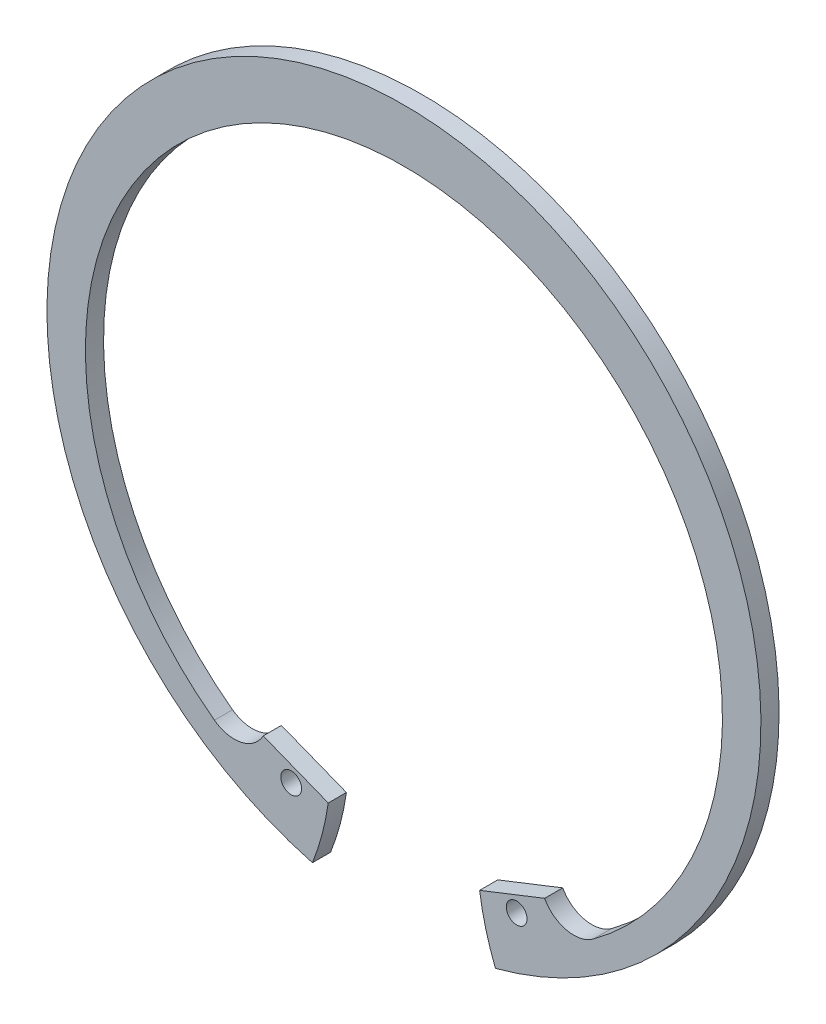
ISO-10303-21;
HEADER;
FILE_DESCRIPTION(('STEP AP214'),'2;1');
FILE_NAME('part.step','',(''),(''),'','','');
FILE_SCHEMA(('AUTOMOTIVE_DESIGN { 1 0 10303 214 1 1 1 1 }'));
ENDSEC;
DATA;
#1=APPLICATION_CONTEXT('core data for automotive mechanical design processes');
#2=APPLICATION_PROTOCOL_DEFINITION('international standard','automotive_design',2000,#1);
#3=PRODUCT_CONTEXT('',#1,'mechanical');
#4=PRODUCT('Part','Part','',(#3));
#5=PRODUCT_RELATED_PRODUCT_CATEGORY('part','',(#4));
#6=PRODUCT_DEFINITION_FORMATION('','',#4);
#7=PRODUCT_DEFINITION_CONTEXT('part definition',#1,'design');
#8=PRODUCT_DEFINITION('design','',#6,#7);
#9=PRODUCT_DEFINITION_SHAPE('','',#8);
#10=(LENGTH_UNIT() NAMED_UNIT(*) SI_UNIT(.MILLI.,.METRE.));
#11=(NAMED_UNIT(*) PLANE_ANGLE_UNIT() SI_UNIT($,.RADIAN.));
#12=(NAMED_UNIT(*) SI_UNIT($,.STERADIAN.) SOLID_ANGLE_UNIT());
#13=UNCERTAINTY_MEASURE_WITH_UNIT(LENGTH_MEASURE(1.E-05),#10,'distance_accuracy_value','');
#14=(GEOMETRIC_REPRESENTATION_CONTEXT(3) GLOBAL_UNCERTAINTY_ASSIGNED_CONTEXT((#13)) GLOBAL_UNIT_ASSIGNED_CONTEXT((#10,
#11,#12)) REPRESENTATION_CONTEXT('',''));
#15=CARTESIAN_POINT('',(0.,0.,0.));
#16=DIRECTION('',(0.,0.,1.));
#17=DIRECTION('',(1.,0.,0.));
#18=AXIS2_PLACEMENT_3D('',#15,#16,#17);
#19=CARTESIAN_POINT('',(0.,0.,-1.3843));
#20=DIRECTION('',(0.,0.,1.));
#21=DIRECTION('',(1.,0.,0.));
#22=AXIS2_PLACEMENT_3D('',#19,#20,#21);
#23=CYLINDRICAL_SURFACE('',#22,54.4957);
#24=CARTESIAN_POINT('',(0.,0.,1.3843));
#25=DIRECTION('',(0.,0.,1.));
#26=DIRECTION('',(-1.,0.,0.));
#27=AXIS2_PLACEMENT_3D('',#24,#25,#26);
#28=CIRCLE('',#27,54.4957);
#29=CARTESIAN_POINT('',(13.9687113237904,-52.6750075694594,1.3843));
#30=VERTEX_POINT('',#29);
#31=CARTESIAN_POINT('',(-13.9687113237904,-52.6750075694594,1.3843));
#32=VERTEX_POINT('',#31);
#33=EDGE_CURVE('E159',#30,#32,#28,.T.);
#34=ORIENTED_EDGE('',*,*,#33,.F.);
#35=DIRECTION('',(0.,0.,1.));
#36=VECTOR('',#35,1.);
#37=CARTESIAN_POINT('',(13.9687113237904,-52.6750075694594,-1.3843));
#38=LINE('',#37,#36);
#39=CARTESIAN_POINT('',(13.9687113237904,-52.6750075694594,-1.3843));
#40=VERTEX_POINT('',#39);
#41=EDGE_CURVE('E99',#40,#30,#38,.T.);
#42=ORIENTED_EDGE('',*,*,#41,.F.);
#43=CARTESIAN_POINT('',(0.,0.,-1.3843));
#44=DIRECTION('',(0.,0.,1.));
#45=DIRECTION('',(-1.,0.,0.));
#46=AXIS2_PLACEMENT_3D('',#43,#44,#45);
#47=CIRCLE('',#46,54.4957);
#48=CARTESIAN_POINT('',(-13.9687113237904,-52.6750075694594,-1.3843));
#49=VERTEX_POINT('',#48);
#50=EDGE_CURVE('E123',#40,#49,#47,.T.);
#51=ORIENTED_EDGE('',*,*,#50,.T.);
#52=DIRECTION('',(0.,0.,1.));
#53=VECTOR('',#52,1.);
#54=CARTESIAN_POINT('',(-13.9687113237904,-52.6750075694594,-1.3843));
#55=LINE('',#54,#53);
#56=EDGE_CURVE('E170',#49,#32,#55,.T.);
#57=ORIENTED_EDGE('',*,*,#56,.T.);
#58=EDGE_LOOP('',(#34,#42,#51,#57));
#59=FACE_BOUND('',#58,.T.);
#60=ADVANCED_FACE('F32',(#59),#23,.T.);
#61=CARTESIAN_POINT('',(11.3157,-43.6549822906848,-1.3843));
#62=DIRECTION('',(-0.366257344602323,0.930513598785561,0.));
#63=DIRECTION('',(-0.930513598785561,-0.366257344602323,0.));
#64=AXIS2_PLACEMENT_3D('',#61,#62,#63);
#65=PLANE('',#64);
#66=DIRECTION('',(-0.930513598785561,-0.366257344602323,0.));
#67=VECTOR('',#66,1.);
#68=CARTESIAN_POINT('',(11.3157,-43.6549822906848,-1.3843));
#69=LINE('',#68,#67);
#70=CARTESIAN_POINT('',(21.4760620340965,-39.6557852626529,-1.3843));
#71=VERTEX_POINT('',#70);
#72=CARTESIAN_POINT('',(11.5520504540915,-43.5619529251558,-1.3843));
#73=VERTEX_POINT('',#72);
#74=EDGE_CURVE('E104',#71,#73,#69,.T.);
#75=ORIENTED_EDGE('',*,*,#74,.T.);
#76=DIRECTION('',(0.,0.,1.));
#77=VECTOR('',#76,1.);
#78=CARTESIAN_POINT('',(11.5520504540915,-43.5619529251558,-1.3843));
#79=LINE('',#78,#77);
#80=CARTESIAN_POINT('',(11.5520504540915,-43.5619529251558,1.3843));
#81=VERTEX_POINT('',#80);
#82=EDGE_CURVE('E97',#73,#81,#79,.T.);
#83=ORIENTED_EDGE('',*,*,#82,.T.);
#84=DIRECTION('',(-0.930513598785561,-0.366257344602323,0.));
#85=VECTOR('',#84,1.);
#86=CARTESIAN_POINT('',(11.3157,-43.6549822906848,1.3843));
#87=LINE('',#86,#85);
#88=CARTESIAN_POINT('',(21.4760620340965,-39.6557852626529,1.3843));
#89=VERTEX_POINT('',#88);
#90=EDGE_CURVE('E103',#89,#81,#87,.T.);
#91=ORIENTED_EDGE('',*,*,#90,.F.);
#92=DIRECTION('',(0.,0.,1.));
#93=VECTOR('',#92,1.);
#94=CARTESIAN_POINT('',(21.4760620340965,-39.6557852626529,-1.3843));
#95=LINE('',#94,#93);
#96=EDGE_CURVE('E53',#71,#89,#95,.T.);
#97=ORIENTED_EDGE('',*,*,#96,.F.);
#98=EDGE_LOOP('',(#75,#83,#91,#97));
#99=FACE_BOUND('',#98,.T.);
#100=ADVANCED_FACE('F102',(#99),#65,.T.);
#101=CARTESIAN_POINT('',(0.,0.,-1.3843));
#102=DIRECTION('',(0.,0.,-1.));
#103=DIRECTION('',(-1.,0.,0.));
#104=AXIS2_PLACEMENT_3D('',#101,#102,#103);
#105=PLANE('',#104);
#106=CARTESIAN_POINT('',(17.210160294145,-43.7241421284516,-1.3843));
#107=DIRECTION('',(0.,0.,1.));
#108=DIRECTION('',(-1.,0.,0.));
#109=AXIS2_PLACEMENT_3D('',#106,#107,#108);
#110=CIRCLE('',#109,1.5875);
#111=CARTESIAN_POINT('',(15.622660294145,-43.7241421284516,-1.3843));
#112=VERTEX_POINT('',#111);
#113=EDGE_CURVE('E112',#112,#112,#110,.T.);
#114=ORIENTED_EDGE('',*,*,#113,.T.);
#115=EDGE_LOOP('',(#114));
#116=FACE_BOUND('',#115,.T.);
#117=CARTESIAN_POINT('',(-17.210160294145,-43.7241421284516,-1.3843));
#118=DIRECTION('',(0.,0.,1.));
#119=DIRECTION('',(1.,0.,0.));
#120=AXIS2_PLACEMENT_3D('',#117,#118,#119);
#121=CIRCLE('',#120,1.5875);
#122=CARTESIAN_POINT('',(-15.622660294145,-43.7241421284516,-1.3843));
#123=VERTEX_POINT('',#122);
#124=EDGE_CURVE('E115',#123,#123,#121,.T.);
#125=ORIENTED_EDGE('',*,*,#124,.T.);
#126=EDGE_LOOP('',(#125));
#127=FACE_BOUND('',#126,.T.);
#128=ORIENTED_EDGE('',*,*,#50,.F.);
#129=CARTESIAN_POINT('',(51.274948351142,-37.9049292776051,-1.3843));
#130=DIRECTION('',(0.,0.,1.));
#131=DIRECTION('',(1.,0.,0.));
#132=AXIS2_PLACEMENT_3D('',#129,#130,#131);
#133=CIRCLE('',#132,40.1236904320683);
#134=EDGE_CURVE('E105',#73,#40,#133,.T.);
#135=ORIENTED_EDGE('',*,*,#134,.F.);
#136=ORIENTED_EDGE('',*,*,#74,.F.);
#137=CARTESIAN_POINT('',(25.9199064504206,-37.2491684796856,-1.3843));
#138=DIRECTION('',(0.,0.,-1.));
#139=DIRECTION('',(-1.,0.,0.));
#140=AXIS2_PLACEMENT_3D('',#137,#138,#139);
#141=CIRCLE('',#140,5.05366773111916);
#142=CARTESIAN_POINT('',(28.9264347651248,-41.3112301519693,-1.3843));
#143=VERTEX_POINT('',#142);
#144=EDGE_CURVE('E133',#143,#71,#141,.T.);
#145=ORIENTED_EDGE('',*,*,#144,.F.);
#146=CARTESIAN_POINT('',(0.,-2.22928923008952,-1.3843));
#147=DIRECTION('',(0.,0.,-1.));
#148=DIRECTION('',(-1.,0.,0.));
#149=AXIS2_PLACEMENT_3D('',#146,#147,#148);
#150=CIRCLE('',#149,48.6223892300895);
#151=CARTESIAN_POINT('',(-28.9264347651248,-41.3112301519693,-1.3843));
#152=VERTEX_POINT('',#151);
#153=EDGE_CURVE('E130',#152,#143,#150,.T.);
#154=ORIENTED_EDGE('',*,*,#153,.F.);
#155=CARTESIAN_POINT('',(-25.9199064504206,-37.2491684796856,-1.3843));
#156=DIRECTION('',(0.,0.,-1.));
#157=DIRECTION('',(1.,0.,0.));
#158=AXIS2_PLACEMENT_3D('',#155,#156,#157);
#159=CIRCLE('',#158,5.05366773111916);
#160=CARTESIAN_POINT('',(-21.4760620340965,-39.6557852626529,-1.3843));
#161=VERTEX_POINT('',#160);
#162=EDGE_CURVE('E127',#161,#152,#159,.T.);
#163=ORIENTED_EDGE('',*,*,#162,.F.);
#164=DIRECTION('',(-0.930513598785561,0.366257344602323,0.));
#165=VECTOR('',#164,1.);
#166=CARTESIAN_POINT('',(-11.3157,-43.6549822906848,-1.3843));
#167=LINE('',#166,#165);
#168=CARTESIAN_POINT('',(-11.5520504540915,-43.5619529251558,-1.3843));
#169=VERTEX_POINT('',#168);
#170=EDGE_CURVE('E125',#169,#161,#167,.T.);
#171=ORIENTED_EDGE('',*,*,#170,.F.);
#172=CARTESIAN_POINT('',(-51.274948351142,-37.9049292776051,-1.3843));
#173=DIRECTION('',(0.,0.,-1.));
#174=DIRECTION('',(-1.,0.,0.));
#175=AXIS2_PLACEMENT_3D('',#172,#173,#174);
#176=CIRCLE('',#175,40.1236904320683);
#177=EDGE_CURVE('E173',#169,#49,#176,.T.);
#178=ORIENTED_EDGE('',*,*,#177,.T.);
#179=EDGE_LOOP('',(#128,#135,#136,#145,#154,#163,#171,#178));
#180=FACE_BOUND('',#179,.T.);
#181=ADVANCED_FACE('F182',(#116,#127,#180),#105,.T.);
#182=CARTESIAN_POINT('',(0.,0.,1.3843));
#183=DIRECTION('',(0.,0.,-1.));
#184=DIRECTION('',(-1.,0.,0.));
#185=AXIS2_PLACEMENT_3D('',#182,#183,#184);
#186=PLANE('',#185);
#187=CARTESIAN_POINT('',(-17.210160294145,-43.7241421284516,1.3843));
#188=DIRECTION('',(0.,0.,1.));
#189=DIRECTION('',(1.,0.,0.));
#190=AXIS2_PLACEMENT_3D('',#187,#188,#189);
#191=CIRCLE('',#190,1.5875);
#192=CARTESIAN_POINT('',(-15.622660294145,-43.7241421284516,1.3843));
#193=VERTEX_POINT('',#192);
#194=EDGE_CURVE('E163',#193,#193,#191,.T.);
#195=ORIENTED_EDGE('',*,*,#194,.F.);
#196=EDGE_LOOP('',(#195));
#197=FACE_BOUND('',#196,.T.);
#198=CARTESIAN_POINT('',(17.210160294145,-43.7241421284516,1.3843));
#199=DIRECTION('',(0.,0.,1.));
#200=DIRECTION('',(-1.,0.,0.));
#201=AXIS2_PLACEMENT_3D('',#198,#199,#200);
#202=CIRCLE('',#201,1.5875);
#203=CARTESIAN_POINT('',(15.622660294145,-43.7241421284516,1.3843));
#204=VERTEX_POINT('',#203);
#205=EDGE_CURVE('E166',#204,#204,#202,.T.);
#206=ORIENTED_EDGE('',*,*,#205,.F.);
#207=EDGE_LOOP('',(#206));
#208=FACE_BOUND('',#207,.T.);
#209=CARTESIAN_POINT('',(51.274948351142,-37.9049292776051,1.3843));
#210=DIRECTION('',(0.,0.,-1.));
#211=DIRECTION('',(-1.,0.,0.));
#212=AXIS2_PLACEMENT_3D('',#209,#210,#211);
#213=CIRCLE('',#212,40.1236904320683);
#214=EDGE_CURVE('E11',#30,#81,#213,.T.);
#215=ORIENTED_EDGE('',*,*,#214,.F.);
#216=ORIENTED_EDGE('',*,*,#33,.T.);
#217=CARTESIAN_POINT('',(-51.274948351142,-37.9049292776051,1.3843));
#218=DIRECTION('',(0.,0.,-1.));
#219=DIRECTION('',(-1.,0.,0.));
#220=AXIS2_PLACEMENT_3D('',#217,#218,#219);
#221=CIRCLE('',#220,40.1236904320683);
#222=CARTESIAN_POINT('',(-11.5520504540915,-43.5619529251558,1.3843));
#223=VERTEX_POINT('',#222);
#224=EDGE_CURVE('E39',#32,#223,#221,.F.);
#225=ORIENTED_EDGE('',*,*,#224,.T.);
#226=DIRECTION('',(-0.930513598785561,0.366257344602323,0.));
#227=VECTOR('',#226,1.);
#228=CARTESIAN_POINT('',(-11.3157,-43.6549822906848,1.3843));
#229=LINE('',#228,#227);
#230=CARTESIAN_POINT('',(-21.4760620340965,-39.6557852626529,1.3843));
#231=VERTEX_POINT('',#230);
#232=EDGE_CURVE('E150',#223,#231,#229,.T.);
#233=ORIENTED_EDGE('',*,*,#232,.T.);
#234=CARTESIAN_POINT('',(-25.9199064504206,-37.2491684796856,1.3843));
#235=DIRECTION('',(0.,0.,-1.));
#236=DIRECTION('',(1.,0.,0.));
#237=AXIS2_PLACEMENT_3D('',#234,#235,#236);
#238=CIRCLE('',#237,5.05366773111916);
#239=CARTESIAN_POINT('',(-28.9264347651248,-41.3112301519693,1.3843));
#240=VERTEX_POINT('',#239);
#241=EDGE_CURVE('E155',#231,#240,#238,.T.);
#242=ORIENTED_EDGE('',*,*,#241,.T.);
#243=CARTESIAN_POINT('',(0.,-2.22928923008952,1.3843));
#244=DIRECTION('',(0.,0.,-1.));
#245=DIRECTION('',(-1.,0.,0.));
#246=AXIS2_PLACEMENT_3D('',#243,#244,#245);
#247=CIRCLE('',#246,48.6223892300895);
#248=CARTESIAN_POINT('',(28.9264347651248,-41.3112301519693,1.3843));
#249=VERTEX_POINT('',#248);
#250=EDGE_CURVE('E117',#240,#249,#247,.T.);
#251=ORIENTED_EDGE('',*,*,#250,.T.);
#252=CARTESIAN_POINT('',(25.9199064504206,-37.2491684796856,1.3843));
#253=DIRECTION('',(0.,0.,-1.));
#254=DIRECTION('',(-1.,0.,0.));
#255=AXIS2_PLACEMENT_3D('',#252,#253,#254);
#256=CIRCLE('',#255,5.05366773111916);
#257=EDGE_CURVE('E111',#249,#89,#256,.T.);
#258=ORIENTED_EDGE('',*,*,#257,.T.);
#259=ORIENTED_EDGE('',*,*,#90,.T.);
#260=EDGE_LOOP('',(#215,#216,#225,#233,#242,#251,#258,#259));
#261=FACE_BOUND('',#260,.T.);
#262=ADVANCED_FACE('F108',(#197,#208,#261),#186,.F.);
#263=CARTESIAN_POINT('',(25.9199064504206,-37.2491684796856,-1.3843));
#264=DIRECTION('',(0.,0.,1.));
#265=DIRECTION('',(1.,0.,0.));
#266=AXIS2_PLACEMENT_3D('',#263,#264,#265);
#267=CYLINDRICAL_SURFACE('',#266,5.05366773111916);
#268=ORIENTED_EDGE('',*,*,#96,.T.);
#269=ORIENTED_EDGE('',*,*,#257,.F.);
#270=DIRECTION('',(0.,0.,1.));
#271=VECTOR('',#270,1.);
#272=CARTESIAN_POINT('',(28.9264347651248,-41.3112301519693,-1.3843));
#273=LINE('',#272,#271);
#274=EDGE_CURVE('E139',#143,#249,#273,.T.);
#275=ORIENTED_EDGE('',*,*,#274,.F.);
#276=ORIENTED_EDGE('',*,*,#144,.T.);
#277=EDGE_LOOP('',(#268,#269,#275,#276));
#278=FACE_BOUND('',#277,.T.);
#279=ADVANCED_FACE('F209',(#278),#267,.F.);
#280=CARTESIAN_POINT('',(0.,-2.22928923008952,-1.3843));
#281=DIRECTION('',(0.,0.,1.));
#282=DIRECTION('',(1.,0.,0.));
#283=AXIS2_PLACEMENT_3D('',#280,#281,#282);
#284=CYLINDRICAL_SURFACE('',#283,48.6223892300895);
#285=ORIENTED_EDGE('',*,*,#274,.T.);
#286=ORIENTED_EDGE('',*,*,#250,.F.);
#287=DIRECTION('',(0.,0.,1.));
#288=VECTOR('',#287,1.);
#289=CARTESIAN_POINT('',(-28.9264347651248,-41.3112301519693,-1.3843));
#290=LINE('',#289,#288);
#291=EDGE_CURVE('E141',#152,#240,#290,.T.);
#292=ORIENTED_EDGE('',*,*,#291,.F.);
#293=ORIENTED_EDGE('',*,*,#153,.T.);
#294=EDGE_LOOP('',(#285,#286,#292,#293));
#295=FACE_BOUND('',#294,.T.);
#296=ADVANCED_FACE('F212',(#295),#284,.F.);
#297=CARTESIAN_POINT('',(-25.9199064504206,-37.2491684796856,-1.3843));
#298=DIRECTION('',(0.,0.,1.));
#299=DIRECTION('',(1.,0.,0.));
#300=AXIS2_PLACEMENT_3D('',#297,#298,#299);
#301=CYLINDRICAL_SURFACE('',#300,5.05366773111916);
#302=ORIENTED_EDGE('',*,*,#291,.T.);
#303=ORIENTED_EDGE('',*,*,#241,.F.);
#304=DIRECTION('',(0.,0.,1.));
#305=VECTOR('',#304,1.);
#306=CARTESIAN_POINT('',(-21.4760620340965,-39.6557852626529,-1.3843));
#307=LINE('',#306,#305);
#308=EDGE_CURVE('E137',#161,#231,#307,.T.);
#309=ORIENTED_EDGE('',*,*,#308,.F.);
#310=ORIENTED_EDGE('',*,*,#162,.T.);
#311=EDGE_LOOP('',(#302,#303,#309,#310));
#312=FACE_BOUND('',#311,.T.);
#313=ADVANCED_FACE('F156',(#312),#301,.F.);
#314=CARTESIAN_POINT('',(-11.3157,-43.6549822906848,-1.3843));
#315=DIRECTION('',(0.366257344602323,0.930513598785561,0.));
#316=DIRECTION('',(-0.930513598785561,0.366257344602323,0.));
#317=AXIS2_PLACEMENT_3D('',#314,#315,#316);
#318=PLANE('',#317);
#319=DIRECTION('',(0.,0.,1.));
#320=VECTOR('',#319,1.);
#321=CARTESIAN_POINT('',(-11.5520504540915,-43.5619529251558,-1.3843));
#322=LINE('',#321,#320);
#323=EDGE_CURVE('E169',#169,#223,#322,.T.);
#324=ORIENTED_EDGE('',*,*,#323,.F.);
#325=ORIENTED_EDGE('',*,*,#170,.T.);
#326=ORIENTED_EDGE('',*,*,#308,.T.);
#327=ORIENTED_EDGE('',*,*,#232,.F.);
#328=EDGE_LOOP('',(#324,#325,#326,#327));
#329=FACE_BOUND('',#328,.T.);
#330=ADVANCED_FACE('F149',(#329),#318,.T.);
#331=CARTESIAN_POINT('',(-17.210160294145,-43.7241421284516,-1.3843));
#332=DIRECTION('',(0.,0.,1.));
#333=DIRECTION('',(1.,0.,0.));
#334=AXIS2_PLACEMENT_3D('',#331,#332,#333);
#335=CYLINDRICAL_SURFACE('',#334,1.5875);
#336=ORIENTED_EDGE('',*,*,#124,.F.);
#337=EDGE_LOOP('',(#336));
#338=FACE_BOUND('',#337,.T.);
#339=ORIENTED_EDGE('',*,*,#194,.T.);
#340=EDGE_LOOP('',(#339));
#341=FACE_BOUND('',#340,.T.);
#342=ADVANCED_FACE('F193',(#338,#341),#335,.F.);
#343=CARTESIAN_POINT('',(17.210160294145,-43.7241421284516,-1.3843));
#344=DIRECTION('',(0.,0.,1.));
#345=DIRECTION('',(1.,0.,0.));
#346=AXIS2_PLACEMENT_3D('',#343,#344,#345);
#347=CYLINDRICAL_SURFACE('',#346,1.5875);
#348=ORIENTED_EDGE('',*,*,#113,.F.);
#349=EDGE_LOOP('',(#348));
#350=FACE_BOUND('',#349,.T.);
#351=ORIENTED_EDGE('',*,*,#205,.T.);
#352=EDGE_LOOP('',(#351));
#353=FACE_BOUND('',#352,.T.);
#354=ADVANCED_FACE('F186',(#350,#353),#347,.F.);
#355=CARTESIAN_POINT('',(-51.274948351142,-37.9049292776051,-1.3843));
#356=DIRECTION('',(0.,0.,1.));
#357=DIRECTION('',(1.,0.,0.));
#358=AXIS2_PLACEMENT_3D('',#355,#356,#357);
#359=CYLINDRICAL_SURFACE('',#358,40.1236904320683);
#360=ORIENTED_EDGE('',*,*,#224,.F.);
#361=ORIENTED_EDGE('',*,*,#56,.F.);
#362=ORIENTED_EDGE('',*,*,#177,.F.);
#363=ORIENTED_EDGE('',*,*,#323,.T.);
#364=EDGE_LOOP('',(#360,#361,#362,#363));
#365=FACE_BOUND('',#364,.T.);
#366=ADVANCED_FACE('F184',(#365),#359,.T.);
#367=CARTESIAN_POINT('',(51.274948351142,-37.9049292776051,-1.3843));
#368=DIRECTION('',(0.,0.,1.));
#369=DIRECTION('',(1.,0.,0.));
#370=AXIS2_PLACEMENT_3D('',#367,#368,#369);
#371=CYLINDRICAL_SURFACE('',#370,40.1236904320683);
#372=ORIENTED_EDGE('',*,*,#82,.F.);
#373=ORIENTED_EDGE('',*,*,#134,.T.);
#374=ORIENTED_EDGE('',*,*,#41,.T.);
#375=ORIENTED_EDGE('',*,*,#214,.T.);
#376=EDGE_LOOP('',(#372,#373,#374,#375));
#377=FACE_BOUND('',#376,.T.);
#378=ADVANCED_FACE('F96',(#377),#371,.T.);
#379=CLOSED_SHELL('',(#60,#100,#181,#262,#279,#296,#313,#330,#342,#354,#366,#378));
#380=MANIFOLD_SOLID_BREP('B2',#379);
#381=ADVANCED_BREP_SHAPE_REPRESENTATION('',(#18,#380),#14);
#382=SHAPE_DEFINITION_REPRESENTATION(#9,#381);
ENDSEC;
END-ISO-10303-21;
